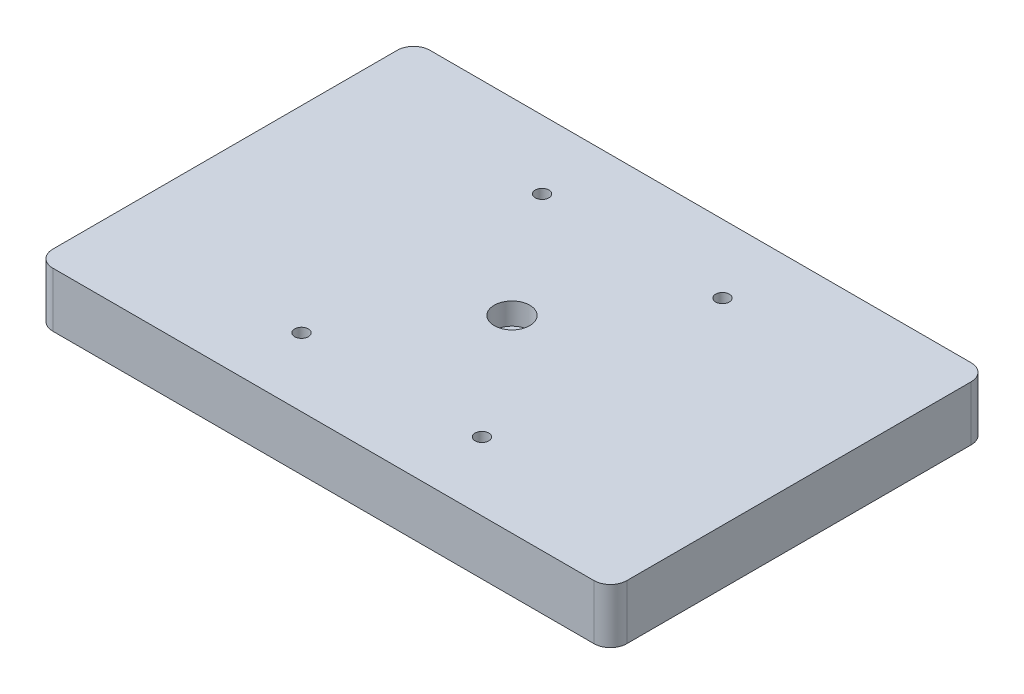
ISO-10303-21;
HEADER;
FILE_DESCRIPTION(('STEP AP214'),'2;1');
FILE_NAME('part.step','',(''),(''),'','','');
FILE_SCHEMA(('AUTOMOTIVE_DESIGN { 1 0 10303 214 1 1 1 1 }'));
ENDSEC;
DATA;
#1=APPLICATION_CONTEXT('core data for automotive mechanical design processes');
#2=APPLICATION_PROTOCOL_DEFINITION('international standard','automotive_design',2000,#1);
#3=PRODUCT_CONTEXT('',#1,'mechanical');
#4=PRODUCT('Part','Part','',(#3));
#5=PRODUCT_RELATED_PRODUCT_CATEGORY('part','',(#4));
#6=PRODUCT_DEFINITION_FORMATION('','',#4);
#7=PRODUCT_DEFINITION_CONTEXT('part definition',#1,'design');
#8=PRODUCT_DEFINITION('design','',#6,#7);
#9=PRODUCT_DEFINITION_SHAPE('','',#8);
#10=(LENGTH_UNIT() NAMED_UNIT(*) SI_UNIT(.MILLI.,.METRE.));
#11=(NAMED_UNIT(*) PLANE_ANGLE_UNIT() SI_UNIT($,.RADIAN.));
#12=(NAMED_UNIT(*) SI_UNIT($,.STERADIAN.) SOLID_ANGLE_UNIT());
#13=UNCERTAINTY_MEASURE_WITH_UNIT(LENGTH_MEASURE(1.E-05),#10,'distance_accuracy_value','');
#14=(GEOMETRIC_REPRESENTATION_CONTEXT(3) GLOBAL_UNCERTAINTY_ASSIGNED_CONTEXT((#13)) GLOBAL_UNIT_ASSIGNED_CONTEXT((#10,
#11,#12)) REPRESENTATION_CONTEXT('',''));
#15=CARTESIAN_POINT('',(0.,0.,0.));
#16=DIRECTION('',(0.,0.,1.));
#17=DIRECTION('',(1.,0.,0.));
#18=AXIS2_PLACEMENT_3D('',#15,#16,#17);
#19=CARTESIAN_POINT('',(52.5,10.,-34.5));
#20=DIRECTION('',(-1.,0.,0.));
#21=DIRECTION('',(0.,0.,1.));
#22=AXIS2_PLACEMENT_3D('',#19,#20,#21);
#23=PLANE('',#22);
#24=DIRECTION('',(0.,0.,-1.));
#25=VECTOR('',#24,1.);
#26=CARTESIAN_POINT('',(52.5,0.,-34.5));
#27=LINE('',#26,#25);
#28=CARTESIAN_POINT('',(52.5,0.,31.5));
#29=VERTEX_POINT('',#28);
#30=CARTESIAN_POINT('',(52.5,0.,-31.5));
#31=VERTEX_POINT('',#30);
#32=EDGE_CURVE('E132',#29,#31,#27,.T.);
#33=ORIENTED_EDGE('',*,*,#32,.T.);
#34=DIRECTION('',(0.,-1.,0.));
#35=VECTOR('',#34,1.);
#36=CARTESIAN_POINT('',(52.5,10.,-31.5));
#37=LINE('',#36,#35);
#38=CARTESIAN_POINT('',(52.5,10.,-31.5));
#39=VERTEX_POINT('',#38);
#40=EDGE_CURVE('E155',#31,#39,#37,.F.);
#41=ORIENTED_EDGE('',*,*,#40,.T.);
#42=DIRECTION('',(0.,0.,-1.));
#43=VECTOR('',#42,1.);
#44=CARTESIAN_POINT('',(52.5,10.,-34.5));
#45=LINE('',#44,#43);
#46=CARTESIAN_POINT('',(52.5,10.,31.5));
#47=VERTEX_POINT('',#46);
#48=EDGE_CURVE('E130',#47,#39,#45,.T.);
#49=ORIENTED_EDGE('',*,*,#48,.F.);
#50=DIRECTION('',(0.,-1.,0.));
#51=VECTOR('',#50,1.);
#52=CARTESIAN_POINT('',(52.5,10.,31.5));
#53=LINE('',#52,#51);
#54=EDGE_CURVE('E152',#47,#29,#53,.T.);
#55=ORIENTED_EDGE('',*,*,#54,.T.);
#56=EDGE_LOOP('',(#33,#41,#49,#55));
#57=FACE_BOUND('',#56,.T.);
#58=ADVANCED_FACE('F37',(#57),#23,.F.);
#59=CARTESIAN_POINT('',(-52.5,10.,-34.5));
#60=DIRECTION('',(0.,0.,1.));
#61=DIRECTION('',(1.,0.,0.));
#62=AXIS2_PLACEMENT_3D('',#59,#60,#61);
#63=PLANE('',#62);
#64=DIRECTION('',(-1.,0.,0.));
#65=VECTOR('',#64,1.);
#66=CARTESIAN_POINT('',(-52.5,0.,-34.5));
#67=LINE('',#66,#65);
#68=CARTESIAN_POINT('',(49.5,0.,-34.5));
#69=VERTEX_POINT('',#68);
#70=CARTESIAN_POINT('',(-49.5,0.,-34.5));
#71=VERTEX_POINT('',#70);
#72=EDGE_CURVE('E128',#69,#71,#67,.T.);
#73=ORIENTED_EDGE('',*,*,#72,.T.);
#74=DIRECTION('',(0.,-1.,0.));
#75=VECTOR('',#74,1.);
#76=CARTESIAN_POINT('',(-49.5,10.,-34.5));
#77=LINE('',#76,#75);
#78=CARTESIAN_POINT('',(-49.5,10.,-34.5));
#79=VERTEX_POINT('',#78);
#80=EDGE_CURVE('E107',#71,#79,#77,.F.);
#81=ORIENTED_EDGE('',*,*,#80,.T.);
#82=DIRECTION('',(-1.,0.,0.));
#83=VECTOR('',#82,1.);
#84=CARTESIAN_POINT('',(-52.5,10.,-34.5));
#85=LINE('',#84,#83);
#86=CARTESIAN_POINT('',(49.5,10.,-34.5));
#87=VERTEX_POINT('',#86);
#88=EDGE_CURVE('E171',#87,#79,#85,.T.);
#89=ORIENTED_EDGE('',*,*,#88,.F.);
#90=DIRECTION('',(0.,-1.,0.));
#91=VECTOR('',#90,1.);
#92=CARTESIAN_POINT('',(49.5,10.,-34.5));
#93=LINE('',#92,#91);
#94=EDGE_CURVE('E112',#87,#69,#93,.T.);
#95=ORIENTED_EDGE('',*,*,#94,.T.);
#96=EDGE_LOOP('',(#73,#81,#89,#95));
#97=FACE_BOUND('',#96,.T.);
#98=ADVANCED_FACE('F235',(#97),#63,.F.);
#99=CARTESIAN_POINT('',(-52.5,10.,-34.5));
#100=DIRECTION('',(1.,0.,0.));
#101=DIRECTION('',(0.,0.,-1.));
#102=AXIS2_PLACEMENT_3D('',#99,#100,#101);
#103=PLANE('',#102);
#104=DIRECTION('',(0.,0.,1.));
#105=VECTOR('',#104,1.);
#106=CARTESIAN_POINT('',(-52.5,10.,-34.5));
#107=LINE('',#106,#105);
#108=CARTESIAN_POINT('',(-52.5,10.,-31.5));
#109=VERTEX_POINT('',#108);
#110=CARTESIAN_POINT('',(-52.5,10.,31.5));
#111=VERTEX_POINT('',#110);
#112=EDGE_CURVE('E121',#109,#111,#107,.T.);
#113=ORIENTED_EDGE('',*,*,#112,.F.);
#114=DIRECTION('',(0.,-1.,0.));
#115=VECTOR('',#114,1.);
#116=CARTESIAN_POINT('',(-52.5,10.,-31.5));
#117=LINE('',#116,#115);
#118=CARTESIAN_POINT('',(-52.5,0.,-31.5));
#119=VERTEX_POINT('',#118);
#120=EDGE_CURVE('E106',#109,#119,#117,.T.);
#121=ORIENTED_EDGE('',*,*,#120,.T.);
#122=DIRECTION('',(0.,0.,1.));
#123=VECTOR('',#122,1.);
#124=CARTESIAN_POINT('',(-52.5,0.,-34.5));
#125=LINE('',#124,#123);
#126=CARTESIAN_POINT('',(-52.5,0.,31.5));
#127=VERTEX_POINT('',#126);
#128=EDGE_CURVE('E119',#119,#127,#125,.T.);
#129=ORIENTED_EDGE('',*,*,#128,.T.);
#130=DIRECTION('',(0.,-1.,0.));
#131=VECTOR('',#130,1.);
#132=CARTESIAN_POINT('',(-52.5,10.,31.5));
#133=LINE('',#132,#131);
#134=EDGE_CURVE('E123',#127,#111,#133,.F.);
#135=ORIENTED_EDGE('',*,*,#134,.T.);
#136=EDGE_LOOP('',(#113,#121,#129,#135));
#137=FACE_BOUND('',#136,.T.);
#138=ADVANCED_FACE('F118',(#137),#103,.F.);
#139=CARTESIAN_POINT('',(-52.5,10.,34.5));
#140=DIRECTION('',(0.,0.,-1.));
#141=DIRECTION('',(-1.,0.,0.));
#142=AXIS2_PLACEMENT_3D('',#139,#140,#141);
#143=PLANE('',#142);
#144=DIRECTION('',(1.,0.,0.));
#145=VECTOR('',#144,1.);
#146=CARTESIAN_POINT('',(-52.5,0.,34.5));
#147=LINE('',#146,#145);
#148=CARTESIAN_POINT('',(-49.5,0.,34.5));
#149=VERTEX_POINT('',#148);
#150=CARTESIAN_POINT('',(49.5,0.,34.5));
#151=VERTEX_POINT('',#150);
#152=EDGE_CURVE('E127',#149,#151,#147,.T.);
#153=ORIENTED_EDGE('',*,*,#152,.T.);
#154=DIRECTION('',(0.,-1.,0.));
#155=VECTOR('',#154,1.);
#156=CARTESIAN_POINT('',(49.5,10.,34.5));
#157=LINE('',#156,#155);
#158=CARTESIAN_POINT('',(49.5,10.,34.5));
#159=VERTEX_POINT('',#158);
#160=EDGE_CURVE('E11',#151,#159,#157,.F.);
#161=ORIENTED_EDGE('',*,*,#160,.T.);
#162=DIRECTION('',(1.,0.,0.));
#163=VECTOR('',#162,1.);
#164=CARTESIAN_POINT('',(-52.5,10.,34.5));
#165=LINE('',#164,#163);
#166=CARTESIAN_POINT('',(-49.5,10.,34.5));
#167=VERTEX_POINT('',#166);
#168=EDGE_CURVE('E136',#167,#159,#165,.T.);
#169=ORIENTED_EDGE('',*,*,#168,.F.);
#170=DIRECTION('',(0.,-1.,0.));
#171=VECTOR('',#170,1.);
#172=CARTESIAN_POINT('',(-49.5,10.,34.5));
#173=LINE('',#172,#171);
#174=EDGE_CURVE('E45',#167,#149,#173,.T.);
#175=ORIENTED_EDGE('',*,*,#174,.T.);
#176=EDGE_LOOP('',(#153,#161,#169,#175));
#177=FACE_BOUND('',#176,.T.);
#178=ADVANCED_FACE('F158',(#177),#143,.F.);
#179=CARTESIAN_POINT('',(0.,10.,0.));
#180=DIRECTION('',(0.,1.,0.));
#181=DIRECTION('',(0.,0.,1.));
#182=AXIS2_PLACEMENT_3D('',#179,#180,#181);
#183=PLANE('',#182);
#184=CARTESIAN_POINT('',(-16.5,10.,-22.));
#185=DIRECTION('',(0.,1.,0.));
#186=DIRECTION('',(0.,0.,1.));
#187=AXIS2_PLACEMENT_3D('',#184,#185,#186);
#188=CIRCLE('',#187,1.24999999999999);
#189=CARTESIAN_POINT('',(-16.5,10.,-20.75));
#190=VERTEX_POINT('',#189);
#191=EDGE_CURVE('E215',#190,#190,#188,.T.);
#192=ORIENTED_EDGE('',*,*,#191,.F.);
#193=EDGE_LOOP('',(#192));
#194=FACE_BOUND('',#193,.T.);
#195=CARTESIAN_POINT('',(16.5,10.,-22.));
#196=DIRECTION('',(0.,1.,0.));
#197=DIRECTION('',(0.,0.,1.));
#198=AXIS2_PLACEMENT_3D('',#195,#196,#197);
#199=CIRCLE('',#198,1.24999999999999);
#200=CARTESIAN_POINT('',(16.5,10.,-20.75));
#201=VERTEX_POINT('',#200);
#202=EDGE_CURVE('E209',#201,#201,#199,.T.);
#203=ORIENTED_EDGE('',*,*,#202,.F.);
#204=EDGE_LOOP('',(#203));
#205=FACE_BOUND('',#204,.T.);
#206=CARTESIAN_POINT('',(-16.5,10.,22.));
#207=DIRECTION('',(0.,1.,0.));
#208=DIRECTION('',(0.,0.,1.));
#209=AXIS2_PLACEMENT_3D('',#206,#207,#208);
#210=CIRCLE('',#209,1.24999999999999);
#211=CARTESIAN_POINT('',(-16.5,10.,23.25));
#212=VERTEX_POINT('',#211);
#213=EDGE_CURVE('E203',#212,#212,#210,.T.);
#214=ORIENTED_EDGE('',*,*,#213,.F.);
#215=EDGE_LOOP('',(#214));
#216=FACE_BOUND('',#215,.T.);
#217=CARTESIAN_POINT('',(16.5,10.,22.));
#218=DIRECTION('',(0.,1.,0.));
#219=DIRECTION('',(0.,0.,1.));
#220=AXIS2_PLACEMENT_3D('',#217,#218,#219);
#221=CIRCLE('',#220,1.24999999999999);
#222=CARTESIAN_POINT('',(16.5,10.,23.25));
#223=VERTEX_POINT('',#222);
#224=EDGE_CURVE('E197',#223,#223,#221,.T.);
#225=ORIENTED_EDGE('',*,*,#224,.F.);
#226=EDGE_LOOP('',(#225));
#227=FACE_BOUND('',#226,.T.);
#228=CARTESIAN_POINT('',(0.,10.,0.));
#229=DIRECTION('',(0.,1.,0.));
#230=DIRECTION('',(0.,0.,1.));
#231=AXIS2_PLACEMENT_3D('',#228,#229,#230);
#232=CIRCLE('',#231,3.25);
#233=CARTESIAN_POINT('',(0.,10.,3.25));
#234=VERTEX_POINT('',#233);
#235=EDGE_CURVE('E189',#234,#234,#232,.T.);
#236=ORIENTED_EDGE('',*,*,#235,.F.);
#237=EDGE_LOOP('',(#236));
#238=FACE_BOUND('',#237,.T.);
#239=ORIENTED_EDGE('',*,*,#88,.T.);
#240=CARTESIAN_POINT('',(-49.5,10.,-31.5));
#241=DIRECTION('',(0.,1.,0.));
#242=DIRECTION('',(0.,0.,1.));
#243=AXIS2_PLACEMENT_3D('',#240,#241,#242);
#244=CIRCLE('',#243,3.);
#245=EDGE_CURVE('E150',#79,#109,#244,.T.);
#246=ORIENTED_EDGE('',*,*,#245,.T.);
#247=ORIENTED_EDGE('',*,*,#112,.T.);
#248=CARTESIAN_POINT('',(-49.5,10.,31.5));
#249=DIRECTION('',(0.,1.,0.));
#250=DIRECTION('',(0.,0.,1.));
#251=AXIS2_PLACEMENT_3D('',#248,#249,#250);
#252=CIRCLE('',#251,3.);
#253=EDGE_CURVE('E57',#111,#167,#252,.T.);
#254=ORIENTED_EDGE('',*,*,#253,.T.);
#255=ORIENTED_EDGE('',*,*,#168,.T.);
#256=CARTESIAN_POINT('',(49.5,10.,31.5));
#257=DIRECTION('',(0.,1.,0.));
#258=DIRECTION('',(0.,0.,1.));
#259=AXIS2_PLACEMENT_3D('',#256,#257,#258);
#260=CIRCLE('',#259,3.);
#261=EDGE_CURVE('E146',#159,#47,#260,.T.);
#262=ORIENTED_EDGE('',*,*,#261,.T.);
#263=ORIENTED_EDGE('',*,*,#48,.T.);
#264=CARTESIAN_POINT('',(49.5,10.,-31.5));
#265=DIRECTION('',(0.,1.,0.));
#266=DIRECTION('',(0.,0.,1.));
#267=AXIS2_PLACEMENT_3D('',#264,#265,#266);
#268=CIRCLE('',#267,3.);
#269=EDGE_CURVE('E148',#39,#87,#268,.T.);
#270=ORIENTED_EDGE('',*,*,#269,.T.);
#271=EDGE_LOOP('',(#239,#246,#247,#254,#255,#262,#263,#270));
#272=FACE_BOUND('',#271,.T.);
#273=ADVANCED_FACE('F221',(#194,#205,#216,#227,#238,#272),#183,.T.);
#274=CARTESIAN_POINT('',(0.,0.,0.));
#275=DIRECTION('',(0.,1.,0.));
#276=DIRECTION('',(0.,0.,1.));
#277=AXIS2_PLACEMENT_3D('',#274,#275,#276);
#278=PLANE('',#277);
#279=CARTESIAN_POINT('',(-16.5,0.,-22.));
#280=DIRECTION('',(0.,1.,0.));
#281=DIRECTION('',(0.,0.,1.));
#282=AXIS2_PLACEMENT_3D('',#279,#280,#281);
#283=CIRCLE('',#282,1.25);
#284=CARTESIAN_POINT('',(-16.5,0.,-20.75));
#285=VERTEX_POINT('',#284);
#286=EDGE_CURVE('E212',#285,#285,#283,.T.);
#287=ORIENTED_EDGE('',*,*,#286,.T.);
#288=EDGE_LOOP('',(#287));
#289=FACE_BOUND('',#288,.T.);
#290=CARTESIAN_POINT('',(16.5,0.,-22.));
#291=DIRECTION('',(0.,1.,0.));
#292=DIRECTION('',(0.,0.,1.));
#293=AXIS2_PLACEMENT_3D('',#290,#291,#292);
#294=CIRCLE('',#293,1.25);
#295=CARTESIAN_POINT('',(16.5,0.,-20.75));
#296=VERTEX_POINT('',#295);
#297=EDGE_CURVE('E206',#296,#296,#294,.T.);
#298=ORIENTED_EDGE('',*,*,#297,.T.);
#299=EDGE_LOOP('',(#298));
#300=FACE_BOUND('',#299,.T.);
#301=CARTESIAN_POINT('',(-16.5,0.,22.));
#302=DIRECTION('',(0.,1.,0.));
#303=DIRECTION('',(0.,0.,1.));
#304=AXIS2_PLACEMENT_3D('',#301,#302,#303);
#305=CIRCLE('',#304,1.25);
#306=CARTESIAN_POINT('',(-16.5,0.,23.25));
#307=VERTEX_POINT('',#306);
#308=EDGE_CURVE('E200',#307,#307,#305,.T.);
#309=ORIENTED_EDGE('',*,*,#308,.T.);
#310=EDGE_LOOP('',(#309));
#311=FACE_BOUND('',#310,.T.);
#312=CARTESIAN_POINT('',(16.5,0.,22.));
#313=DIRECTION('',(0.,1.,0.));
#314=DIRECTION('',(0.,0.,1.));
#315=AXIS2_PLACEMENT_3D('',#312,#313,#314);
#316=CIRCLE('',#315,1.25);
#317=CARTESIAN_POINT('',(16.5,0.,23.25));
#318=VERTEX_POINT('',#317);
#319=EDGE_CURVE('E194',#318,#318,#316,.T.);
#320=ORIENTED_EDGE('',*,*,#319,.T.);
#321=EDGE_LOOP('',(#320));
#322=FACE_BOUND('',#321,.T.);
#323=CARTESIAN_POINT('',(0.,0.,0.));
#324=DIRECTION('',(0.,1.,0.));
#325=DIRECTION('',(0.,0.,1.));
#326=AXIS2_PLACEMENT_3D('',#323,#324,#325);
#327=CIRCLE('',#326,1.7);
#328=CARTESIAN_POINT('',(0.,0.,1.7));
#329=VERTEX_POINT('',#328);
#330=EDGE_CURVE('E176',#329,#329,#327,.T.);
#331=ORIENTED_EDGE('',*,*,#330,.T.);
#332=EDGE_LOOP('',(#331));
#333=FACE_BOUND('',#332,.T.);
#334=ORIENTED_EDGE('',*,*,#128,.F.);
#335=CARTESIAN_POINT('',(-49.5,0.,-31.5));
#336=DIRECTION('',(0.,1.,0.));
#337=DIRECTION('',(0.,0.,1.));
#338=AXIS2_PLACEMENT_3D('',#335,#336,#337);
#339=CIRCLE('',#338,3.);
#340=EDGE_CURVE('E102',#119,#71,#339,.F.);
#341=ORIENTED_EDGE('',*,*,#340,.T.);
#342=ORIENTED_EDGE('',*,*,#72,.F.);
#343=CARTESIAN_POINT('',(49.5,0.,-31.5));
#344=DIRECTION('',(0.,1.,0.));
#345=DIRECTION('',(0.,0.,1.));
#346=AXIS2_PLACEMENT_3D('',#343,#344,#345);
#347=CIRCLE('',#346,3.);
#348=EDGE_CURVE('E113',#69,#31,#347,.F.);
#349=ORIENTED_EDGE('',*,*,#348,.T.);
#350=ORIENTED_EDGE('',*,*,#32,.F.);
#351=CARTESIAN_POINT('',(49.5,0.,31.5));
#352=DIRECTION('',(0.,1.,0.));
#353=DIRECTION('',(0.,0.,1.));
#354=AXIS2_PLACEMENT_3D('',#351,#352,#353);
#355=CIRCLE('',#354,3.);
#356=EDGE_CURVE('E139',#29,#151,#355,.F.);
#357=ORIENTED_EDGE('',*,*,#356,.T.);
#358=ORIENTED_EDGE('',*,*,#152,.F.);
#359=CARTESIAN_POINT('',(-49.5,0.,31.5));
#360=DIRECTION('',(0.,1.,0.));
#361=DIRECTION('',(0.,0.,1.));
#362=AXIS2_PLACEMENT_3D('',#359,#360,#361);
#363=CIRCLE('',#362,3.);
#364=EDGE_CURVE('E122',#149,#127,#363,.F.);
#365=ORIENTED_EDGE('',*,*,#364,.T.);
#366=EDGE_LOOP('',(#334,#341,#342,#349,#350,#357,#358,#365));
#367=FACE_BOUND('',#366,.T.);
#368=ADVANCED_FACE('F125',(#289,#300,#311,#322,#333,#367),#278,.F.);
#369=CARTESIAN_POINT('',(-49.5,10.,-31.5));
#370=DIRECTION('',(0.,-1.,0.));
#371=DIRECTION('',(0.,0.,-1.));
#372=AXIS2_PLACEMENT_3D('',#369,#370,#371);
#373=CYLINDRICAL_SURFACE('',#372,3.);
#374=ORIENTED_EDGE('',*,*,#245,.F.);
#375=ORIENTED_EDGE('',*,*,#80,.F.);
#376=ORIENTED_EDGE('',*,*,#340,.F.);
#377=ORIENTED_EDGE('',*,*,#120,.F.);
#378=EDGE_LOOP('',(#374,#375,#376,#377));
#379=FACE_BOUND('',#378,.T.);
#380=ADVANCED_FACE('F105',(#379),#373,.T.);
#381=CARTESIAN_POINT('',(49.5,10.,-31.5));
#382=DIRECTION('',(0.,-1.,0.));
#383=DIRECTION('',(0.,0.,-1.));
#384=AXIS2_PLACEMENT_3D('',#381,#382,#383);
#385=CYLINDRICAL_SURFACE('',#384,3.);
#386=ORIENTED_EDGE('',*,*,#269,.F.);
#387=ORIENTED_EDGE('',*,*,#40,.F.);
#388=ORIENTED_EDGE('',*,*,#348,.F.);
#389=ORIENTED_EDGE('',*,*,#94,.F.);
#390=EDGE_LOOP('',(#386,#387,#388,#389));
#391=FACE_BOUND('',#390,.T.);
#392=ADVANCED_FACE('F237',(#391),#385,.T.);
#393=CARTESIAN_POINT('',(49.5,10.,31.5));
#394=DIRECTION('',(0.,-1.,0.));
#395=DIRECTION('',(0.,0.,-1.));
#396=AXIS2_PLACEMENT_3D('',#393,#394,#395);
#397=CYLINDRICAL_SURFACE('',#396,3.);
#398=ORIENTED_EDGE('',*,*,#261,.F.);
#399=ORIENTED_EDGE('',*,*,#160,.F.);
#400=ORIENTED_EDGE('',*,*,#356,.F.);
#401=ORIENTED_EDGE('',*,*,#54,.F.);
#402=EDGE_LOOP('',(#398,#399,#400,#401));
#403=FACE_BOUND('',#402,.T.);
#404=ADVANCED_FACE('F165',(#403),#397,.T.);
#405=CARTESIAN_POINT('',(-49.5,10.,31.5));
#406=DIRECTION('',(0.,-1.,0.));
#407=DIRECTION('',(0.,0.,-1.));
#408=AXIS2_PLACEMENT_3D('',#405,#406,#407);
#409=CYLINDRICAL_SURFACE('',#408,3.);
#410=ORIENTED_EDGE('',*,*,#253,.F.);
#411=ORIENTED_EDGE('',*,*,#134,.F.);
#412=ORIENTED_EDGE('',*,*,#364,.F.);
#413=ORIENTED_EDGE('',*,*,#174,.F.);
#414=EDGE_LOOP('',(#410,#411,#412,#413));
#415=FACE_BOUND('',#414,.T.);
#416=ADVANCED_FACE('F39',(#415),#409,.T.);
#417=CARTESIAN_POINT('',(0.,10.,0.));
#418=DIRECTION('',(0.,1.,0.));
#419=DIRECTION('',(0.,0.,1.));
#420=AXIS2_PLACEMENT_3D('',#417,#418,#419);
#421=CYLINDRICAL_SURFACE('',#420,1.7);
#422=ORIENTED_EDGE('',*,*,#330,.F.);
#423=EDGE_LOOP('',(#422));
#424=FACE_BOUND('',#423,.T.);
#425=CARTESIAN_POINT('',(0.,6.,0.));
#426=DIRECTION('',(0.,1.,0.));
#427=DIRECTION('',(0.,0.,1.));
#428=AXIS2_PLACEMENT_3D('',#425,#426,#427);
#429=CIRCLE('',#428,1.7);
#430=CARTESIAN_POINT('',(0.,6.,1.7));
#431=VERTEX_POINT('',#430);
#432=EDGE_CURVE('E181',#431,#431,#429,.T.);
#433=ORIENTED_EDGE('',*,*,#432,.T.);
#434=EDGE_LOOP('',(#433));
#435=FACE_BOUND('',#434,.T.);
#436=ADVANCED_FACE('F259',(#424,#435),#421,.F.);
#437=CARTESIAN_POINT('',(1.7,6.,0.));
#438=DIRECTION('',(0.,-1.,0.));
#439=DIRECTION('',(0.,0.,-1.));
#440=AXIS2_PLACEMENT_3D('',#437,#438,#439);
#441=PLANE('',#440);
#442=ORIENTED_EDGE('',*,*,#432,.F.);
#443=EDGE_LOOP('',(#442));
#444=FACE_BOUND('',#443,.T.);
#445=CARTESIAN_POINT('',(0.,6.,0.));
#446=DIRECTION('',(0.,1.,0.));
#447=DIRECTION('',(0.,0.,1.));
#448=AXIS2_PLACEMENT_3D('',#445,#446,#447);
#449=CIRCLE('',#448,3.25);
#450=CARTESIAN_POINT('',(0.,6.,3.25));
#451=VERTEX_POINT('',#450);
#452=EDGE_CURVE('E185',#451,#451,#449,.T.);
#453=ORIENTED_EDGE('',*,*,#452,.T.);
#454=EDGE_LOOP('',(#453));
#455=FACE_BOUND('',#454,.T.);
#456=ADVANCED_FACE('F262',(#444,#455),#441,.F.);
#457=CARTESIAN_POINT('',(0.,10.,0.));
#458=DIRECTION('',(0.,1.,0.));
#459=DIRECTION('',(0.,0.,1.));
#460=AXIS2_PLACEMENT_3D('',#457,#458,#459);
#461=CYLINDRICAL_SURFACE('',#460,3.25);
#462=ORIENTED_EDGE('',*,*,#452,.F.);
#463=EDGE_LOOP('',(#462));
#464=FACE_BOUND('',#463,.T.);
#465=ORIENTED_EDGE('',*,*,#235,.T.);
#466=EDGE_LOOP('',(#465));
#467=FACE_BOUND('',#466,.T.);
#468=ADVANCED_FACE('F266',(#464,#467),#461,.F.);
#469=CARTESIAN_POINT('',(16.5,10.,22.));
#470=DIRECTION('',(0.,1.,0.));
#471=DIRECTION('',(0.,0.,1.));
#472=AXIS2_PLACEMENT_3D('',#469,#470,#471);
#473=CYLINDRICAL_SURFACE('',#472,1.24999999999999);
#474=ORIENTED_EDGE('',*,*,#319,.F.);
#475=EDGE_LOOP('',(#474));
#476=FACE_BOUND('',#475,.T.);
#477=ORIENTED_EDGE('',*,*,#224,.T.);
#478=EDGE_LOOP('',(#477));
#479=FACE_BOUND('',#478,.T.);
#480=ADVANCED_FACE('F270',(#476,#479),#473,.F.);
#481=CARTESIAN_POINT('',(-16.5,10.,22.));
#482=DIRECTION('',(0.,1.,0.));
#483=DIRECTION('',(0.,0.,1.));
#484=AXIS2_PLACEMENT_3D('',#481,#482,#483);
#485=CYLINDRICAL_SURFACE('',#484,1.24999999999999);
#486=ORIENTED_EDGE('',*,*,#308,.F.);
#487=EDGE_LOOP('',(#486));
#488=FACE_BOUND('',#487,.T.);
#489=ORIENTED_EDGE('',*,*,#213,.T.);
#490=EDGE_LOOP('',(#489));
#491=FACE_BOUND('',#490,.T.);
#492=ADVANCED_FACE('F274',(#488,#491),#485,.F.);
#493=CARTESIAN_POINT('',(16.5,10.,-22.));
#494=DIRECTION('',(0.,1.,0.));
#495=DIRECTION('',(0.,0.,1.));
#496=AXIS2_PLACEMENT_3D('',#493,#494,#495);
#497=CYLINDRICAL_SURFACE('',#496,1.24999999999999);
#498=ORIENTED_EDGE('',*,*,#297,.F.);
#499=EDGE_LOOP('',(#498));
#500=FACE_BOUND('',#499,.T.);
#501=ORIENTED_EDGE('',*,*,#202,.T.);
#502=EDGE_LOOP('',(#501));
#503=FACE_BOUND('',#502,.T.);
#504=ADVANCED_FACE('F278',(#500,#503),#497,.F.);
#505=CARTESIAN_POINT('',(-16.5,10.,-22.));
#506=DIRECTION('',(0.,1.,0.));
#507=DIRECTION('',(0.,0.,1.));
#508=AXIS2_PLACEMENT_3D('',#505,#506,#507);
#509=CYLINDRICAL_SURFACE('',#508,1.24999999999999);
#510=ORIENTED_EDGE('',*,*,#286,.F.);
#511=EDGE_LOOP('',(#510));
#512=FACE_BOUND('',#511,.T.);
#513=ORIENTED_EDGE('',*,*,#191,.T.);
#514=EDGE_LOOP('',(#513));
#515=FACE_BOUND('',#514,.T.);
#516=ADVANCED_FACE('F219',(#512,#515),#509,.F.);
#517=CLOSED_SHELL('',(#58,#98,#138,#178,#273,#368,#380,#392,#404,#416,#436,#456,#468,#480,#492,
#504,#516));
#518=MANIFOLD_SOLID_BREP('B2',#517);
#519=ADVANCED_BREP_SHAPE_REPRESENTATION('',(#18,#518),#14);
#520=SHAPE_DEFINITION_REPRESENTATION(#9,#519);
ENDSEC;
END-ISO-10303-21;
